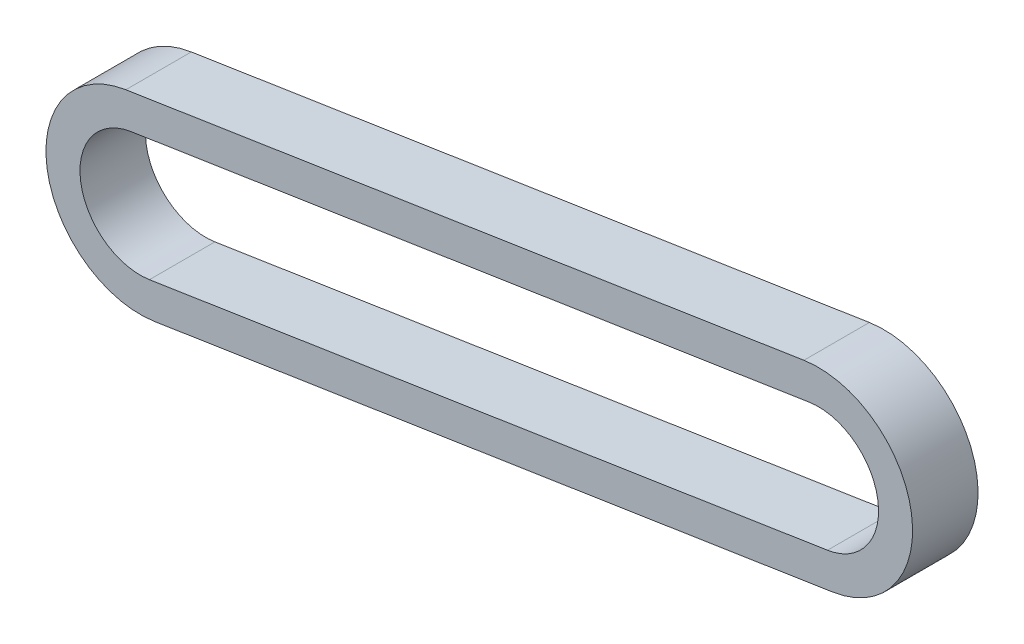
ISO-10303-21;
HEADER;
FILE_DESCRIPTION(('STEP AP214'),'2;1');
FILE_NAME('part.step','',(''),(''),'','','');
FILE_SCHEMA(('AUTOMOTIVE_DESIGN { 1 0 10303 214 1 1 1 1 }'));
ENDSEC;
DATA;
#1=APPLICATION_CONTEXT('core data for automotive mechanical design processes');
#2=APPLICATION_PROTOCOL_DEFINITION('international standard','automotive_design',2000,#1);
#3=PRODUCT_CONTEXT('',#1,'mechanical');
#4=PRODUCT('Part','Part','',(#3));
#5=PRODUCT_RELATED_PRODUCT_CATEGORY('part','',(#4));
#6=PRODUCT_DEFINITION_FORMATION('','',#4);
#7=PRODUCT_DEFINITION_CONTEXT('part definition',#1,'design');
#8=PRODUCT_DEFINITION('design','',#6,#7);
#9=PRODUCT_DEFINITION_SHAPE('','',#8);
#10=(LENGTH_UNIT() NAMED_UNIT(*) SI_UNIT(.MILLI.,.METRE.));
#11=(NAMED_UNIT(*) PLANE_ANGLE_UNIT() SI_UNIT($,.RADIAN.));
#12=(NAMED_UNIT(*) SI_UNIT($,.STERADIAN.) SOLID_ANGLE_UNIT());
#13=UNCERTAINTY_MEASURE_WITH_UNIT(LENGTH_MEASURE(1.E-05),#10,'distance_accuracy_value','');
#14=(GEOMETRIC_REPRESENTATION_CONTEXT(3) GLOBAL_UNCERTAINTY_ASSIGNED_CONTEXT((#13)) GLOBAL_UNIT_ASSIGNED_CONTEXT((#10,
#11,#12)) REPRESENTATION_CONTEXT('',''));
#15=CARTESIAN_POINT('',(0.,0.,0.));
#16=DIRECTION('',(0.,0.,1.));
#17=DIRECTION('',(1.,0.,0.));
#18=AXIS2_PLACEMENT_3D('',#15,#16,#17);
#19=CARTESIAN_POINT('',(32.883927320197,5.08,3.175));
#20=DIRECTION('',(0.,0.,1.));
#21=DIRECTION('',(1.,0.,0.));
#22=AXIS2_PLACEMENT_3D('',#19,#20,#21);
#23=PLANE('',#22);
#24=CARTESIAN_POINT('',(32.883927320197,5.08,3.175));
#25=DIRECTION('',(0.,0.,1.));
#26=DIRECTION('',(1.,0.,0.));
#27=AXIS2_PLACEMENT_3D('',#24,#25,#26);
#28=CIRCLE('',#27,4.572);
#29=CARTESIAN_POINT('',(33.5819425873726,0.561597772797356,3.175));
#30=VERTEX_POINT('',#29);
#31=CARTESIAN_POINT('',(32.1859120530214,9.59840222720264,3.175));
#32=VERTEX_POINT('',#31);
#33=EDGE_CURVE('E153',#30,#32,#28,.T.);
#34=ORIENTED_EDGE('',*,*,#33,.T.);
#35=DIRECTION('',(-0.988276952581506,-0.152671755725191,0.));
#36=VECTOR('',#35,1.);
#37=CARTESIAN_POINT('',(32.1859120530214,9.59840222720264,3.175));
#38=LINE('',#37,#36);
#39=CARTESIAN_POINT('',(-0.698015267175582,4.51840222720264,3.175));
#40=VERTEX_POINT('',#39);
#41=EDGE_CURVE('E157',#32,#40,#38,.T.);
#42=ORIENTED_EDGE('',*,*,#41,.T.);
#43=CARTESIAN_POINT('',(0.,0.,3.175));
#44=DIRECTION('',(0.,0.,1.));
#45=DIRECTION('',(1.,0.,0.));
#46=AXIS2_PLACEMENT_3D('',#43,#44,#45);
#47=CIRCLE('',#46,4.572);
#48=CARTESIAN_POINT('',(0.69801526717557,-4.51840222720264,3.175));
#49=VERTEX_POINT('',#48);
#50=EDGE_CURVE('E161',#40,#49,#47,.T.);
#51=ORIENTED_EDGE('',*,*,#50,.T.);
#52=DIRECTION('',(0.988276952581506,0.152671755725191,0.));
#53=VECTOR('',#52,1.);
#54=CARTESIAN_POINT('',(0.69801526717557,-4.51840222720265,3.175));
#55=LINE('',#54,#53);
#56=EDGE_CURVE('E164',#49,#30,#55,.T.);
#57=ORIENTED_EDGE('',*,*,#56,.T.);
#58=EDGE_LOOP('',(#34,#42,#51,#57));
#59=FACE_BOUND('',#58,.T.);
#60=DIRECTION('',(0.988276952581506,0.152671755725191,0.));
#61=VECTOR('',#60,1.);
#62=CARTESIAN_POINT('',(0.445954198473282,-2.88675697849058,3.175));
#63=LINE('',#62,#61);
#64=CARTESIAN_POINT('',(0.445954198473282,-2.88675697849058,3.175));
#65=VERTEX_POINT('',#64);
#66=CARTESIAN_POINT('',(33.3298815186703,2.19324302150942,3.175));
#67=VERTEX_POINT('',#66);
#68=EDGE_CURVE('E114',#65,#67,#63,.T.);
#69=ORIENTED_EDGE('',*,*,#68,.F.);
#70=CARTESIAN_POINT('',(0.,0.,3.175));
#71=DIRECTION('',(0.,0.,1.));
#72=DIRECTION('',(1.,0.,0.));
#73=AXIS2_PLACEMENT_3D('',#70,#71,#72);
#74=CIRCLE('',#73,2.921);
#75=CARTESIAN_POINT('',(-0.445954198473282,2.88675697849058,3.175));
#76=VERTEX_POINT('',#75);
#77=EDGE_CURVE('E105',#76,#65,#74,.T.);
#78=ORIENTED_EDGE('',*,*,#77,.F.);
#79=DIRECTION('',(-0.988276952581506,-0.152671755725191,0.));
#80=VECTOR('',#79,1.);
#81=CARTESIAN_POINT('',(32.4379731217237,7.96675697849058,3.175));
#82=LINE('',#81,#80);
#83=CARTESIAN_POINT('',(32.4379731217237,7.96675697849058,3.175));
#84=VERTEX_POINT('',#83);
#85=EDGE_CURVE('E131',#84,#76,#82,.T.);
#86=ORIENTED_EDGE('',*,*,#85,.F.);
#87=CARTESIAN_POINT('',(32.883927320197,5.08,3.175));
#88=DIRECTION('',(0.,0.,1.));
#89=DIRECTION('',(1.,0.,0.));
#90=AXIS2_PLACEMENT_3D('',#87,#88,#89);
#91=CIRCLE('',#90,2.921);
#92=EDGE_CURVE('E127',#67,#84,#91,.T.);
#93=ORIENTED_EDGE('',*,*,#92,.F.);
#94=EDGE_LOOP('',(#69,#78,#86,#93));
#95=FACE_BOUND('',#94,.T.);
#96=ADVANCED_FACE('F39',(#59,#95),#23,.T.);
#97=CARTESIAN_POINT('',(32.883927320197,5.08,0.));
#98=DIRECTION('',(0.,0.,1.));
#99=DIRECTION('',(1.,0.,0.));
#100=AXIS2_PLACEMENT_3D('',#97,#98,#99);
#101=PLANE('',#100);
#102=CARTESIAN_POINT('',(32.883927320197,5.08,0.));
#103=DIRECTION('',(0.,0.,1.));
#104=DIRECTION('',(1.,0.,0.));
#105=AXIS2_PLACEMENT_3D('',#102,#103,#104);
#106=CIRCLE('',#105,4.572);
#107=CARTESIAN_POINT('',(33.5819425873726,0.561597772797356,0.));
#108=VERTEX_POINT('',#107);
#109=CARTESIAN_POINT('',(32.1859120530214,9.59840222720264,0.));
#110=VERTEX_POINT('',#109);
#111=EDGE_CURVE('E123',#108,#110,#106,.T.);
#112=ORIENTED_EDGE('',*,*,#111,.F.);
#113=DIRECTION('',(0.988276952581506,0.152671755725191,0.));
#114=VECTOR('',#113,1.);
#115=CARTESIAN_POINT('',(0.69801526717557,-4.51840222720265,0.));
#116=LINE('',#115,#114);
#117=CARTESIAN_POINT('',(0.69801526717557,-4.51840222720264,0.));
#118=VERTEX_POINT('',#117);
#119=EDGE_CURVE('E158',#118,#108,#116,.T.);
#120=ORIENTED_EDGE('',*,*,#119,.F.);
#121=CARTESIAN_POINT('',(0.,0.,0.));
#122=DIRECTION('',(0.,0.,1.));
#123=DIRECTION('',(1.,0.,0.));
#124=AXIS2_PLACEMENT_3D('',#121,#122,#123);
#125=CIRCLE('',#124,4.572);
#126=CARTESIAN_POINT('',(-0.698015267175582,4.51840222720264,0.));
#127=VERTEX_POINT('',#126);
#128=EDGE_CURVE('E174',#127,#118,#125,.T.);
#129=ORIENTED_EDGE('',*,*,#128,.F.);
#130=DIRECTION('',(-0.988276952581506,-0.152671755725191,0.));
#131=VECTOR('',#130,1.);
#132=CARTESIAN_POINT('',(32.1859120530214,9.59840222720264,0.));
#133=LINE('',#132,#131);
#134=EDGE_CURVE('E171',#110,#127,#133,.T.);
#135=ORIENTED_EDGE('',*,*,#134,.F.);
#136=EDGE_LOOP('',(#112,#120,#129,#135));
#137=FACE_BOUND('',#136,.T.);
#138=CARTESIAN_POINT('',(0.,0.,0.));
#139=DIRECTION('',(0.,0.,1.));
#140=DIRECTION('',(1.,0.,0.));
#141=AXIS2_PLACEMENT_3D('',#138,#139,#140);
#142=CIRCLE('',#141,2.921);
#143=CARTESIAN_POINT('',(-0.445954198473278,2.88675697849058,0.));
#144=VERTEX_POINT('',#143);
#145=CARTESIAN_POINT('',(0.445954198473282,-2.88675697849058,0.));
#146=VERTEX_POINT('',#145);
#147=EDGE_CURVE('E63',#144,#146,#142,.T.);
#148=ORIENTED_EDGE('',*,*,#147,.T.);
#149=DIRECTION('',(0.988276952581506,0.152671755725191,0.));
#150=VECTOR('',#149,1.);
#151=CARTESIAN_POINT('',(0.445954198473282,-2.88675697849058,0.));
#152=LINE('',#151,#150);
#153=CARTESIAN_POINT('',(33.3298815186703,2.19324302150942,0.));
#154=VERTEX_POINT('',#153);
#155=EDGE_CURVE('E121',#146,#154,#152,.T.);
#156=ORIENTED_EDGE('',*,*,#155,.T.);
#157=CARTESIAN_POINT('',(32.883927320197,5.08,0.));
#158=DIRECTION('',(0.,0.,1.));
#159=DIRECTION('',(1.,0.,0.));
#160=AXIS2_PLACEMENT_3D('',#157,#158,#159);
#161=CIRCLE('',#160,2.921);
#162=CARTESIAN_POINT('',(32.4379731217237,7.96675697849058,0.));
#163=VERTEX_POINT('',#162);
#164=EDGE_CURVE('E140',#154,#163,#161,.T.);
#165=ORIENTED_EDGE('',*,*,#164,.T.);
#166=DIRECTION('',(-0.988276952581506,-0.152671755725191,0.));
#167=VECTOR('',#166,1.);
#168=CARTESIAN_POINT('',(32.4379731217237,7.96675697849058,0.));
#169=LINE('',#168,#167);
#170=EDGE_CURVE('E115',#163,#144,#169,.T.);
#171=ORIENTED_EDGE('',*,*,#170,.T.);
#172=EDGE_LOOP('',(#148,#156,#165,#171));
#173=FACE_BOUND('',#172,.T.);
#174=ADVANCED_FACE('F197',(#137,#173),#101,.F.);
#175=CARTESIAN_POINT('',(32.883927320197,5.08,3.175));
#176=DIRECTION('',(0.,0.,-1.));
#177=DIRECTION('',(-1.,0.,0.));
#178=AXIS2_PLACEMENT_3D('',#175,#176,#177);
#179=CYLINDRICAL_SURFACE('',#178,4.572);
#180=ORIENTED_EDGE('',*,*,#111,.T.);
#181=DIRECTION('',(0.,0.,-1.));
#182=VECTOR('',#181,1.);
#183=CARTESIAN_POINT('',(32.1859120530214,9.59840222720264,3.175));
#184=LINE('',#183,#182);
#185=EDGE_CURVE('E11',#32,#110,#184,.T.);
#186=ORIENTED_EDGE('',*,*,#185,.F.);
#187=ORIENTED_EDGE('',*,*,#33,.F.);
#188=DIRECTION('',(0.,0.,-1.));
#189=VECTOR('',#188,1.);
#190=CARTESIAN_POINT('',(33.5819425873726,0.561597772797356,3.175));
#191=LINE('',#190,#189);
#192=EDGE_CURVE('E167',#30,#108,#191,.T.);
#193=ORIENTED_EDGE('',*,*,#192,.T.);
#194=EDGE_LOOP('',(#180,#186,#187,#193));
#195=FACE_BOUND('',#194,.T.);
#196=ADVANCED_FACE('F41',(#195),#179,.T.);
#197=CARTESIAN_POINT('',(32.1859120530214,9.59840222720264,3.175));
#198=DIRECTION('',(0.152671755725191,-0.988276952581506,0.));
#199=DIRECTION('',(0.988276952581506,0.152671755725191,0.));
#200=AXIS2_PLACEMENT_3D('',#197,#198,#199);
#201=PLANE('',#200);
#202=ORIENTED_EDGE('',*,*,#134,.T.);
#203=DIRECTION('',(0.,0.,-1.));
#204=VECTOR('',#203,1.);
#205=CARTESIAN_POINT('',(-0.698015267175582,4.51840222720264,3.175));
#206=LINE('',#205,#204);
#207=EDGE_CURVE('E48',#40,#127,#206,.T.);
#208=ORIENTED_EDGE('',*,*,#207,.F.);
#209=ORIENTED_EDGE('',*,*,#41,.F.);
#210=ORIENTED_EDGE('',*,*,#185,.T.);
#211=EDGE_LOOP('',(#202,#208,#209,#210));
#212=FACE_BOUND('',#211,.T.);
#213=ADVANCED_FACE('F207',(#212),#201,.F.);
#214=CARTESIAN_POINT('',(0.,0.,3.175));
#215=DIRECTION('',(0.,0.,-1.));
#216=DIRECTION('',(-1.,0.,0.));
#217=AXIS2_PLACEMENT_3D('',#214,#215,#216);
#218=CYLINDRICAL_SURFACE('',#217,4.572);
#219=ORIENTED_EDGE('',*,*,#128,.T.);
#220=DIRECTION('',(0.,0.,-1.));
#221=VECTOR('',#220,1.);
#222=CARTESIAN_POINT('',(0.69801526717557,-4.51840222720264,3.175));
#223=LINE('',#222,#221);
#224=EDGE_CURVE('E182',#49,#118,#223,.T.);
#225=ORIENTED_EDGE('',*,*,#224,.F.);
#226=ORIENTED_EDGE('',*,*,#50,.F.);
#227=ORIENTED_EDGE('',*,*,#207,.T.);
#228=EDGE_LOOP('',(#219,#225,#226,#227));
#229=FACE_BOUND('',#228,.T.);
#230=ADVANCED_FACE('F191',(#229),#218,.T.);
#231=CARTESIAN_POINT('',(0.69801526717557,-4.51840222720265,3.175));
#232=DIRECTION('',(-0.152671755725191,0.988276952581506,0.));
#233=DIRECTION('',(-0.988276952581506,-0.152671755725191,0.));
#234=AXIS2_PLACEMENT_3D('',#231,#232,#233);
#235=PLANE('',#234);
#236=ORIENTED_EDGE('',*,*,#119,.T.);
#237=ORIENTED_EDGE('',*,*,#192,.F.);
#238=ORIENTED_EDGE('',*,*,#56,.F.);
#239=ORIENTED_EDGE('',*,*,#224,.T.);
#240=EDGE_LOOP('',(#236,#237,#238,#239));
#241=FACE_BOUND('',#240,.T.);
#242=ADVANCED_FACE('F201',(#241),#235,.F.);
#243=CARTESIAN_POINT('',(0.,0.,3.175));
#244=DIRECTION('',(0.,0.,-1.));
#245=DIRECTION('',(-1.,0.,0.));
#246=AXIS2_PLACEMENT_3D('',#243,#244,#245);
#247=CYLINDRICAL_SURFACE('',#246,2.921);
#248=ORIENTED_EDGE('',*,*,#147,.F.);
#249=DIRECTION('',(0.,0.,-1.));
#250=VECTOR('',#249,1.);
#251=CARTESIAN_POINT('',(-0.445954198473282,2.88675697849058,3.175));
#252=LINE('',#251,#250);
#253=EDGE_CURVE('E109',#76,#144,#252,.T.);
#254=ORIENTED_EDGE('',*,*,#253,.F.);
#255=ORIENTED_EDGE('',*,*,#77,.T.);
#256=DIRECTION('',(0.,0.,-1.));
#257=VECTOR('',#256,1.);
#258=CARTESIAN_POINT('',(0.445954198473282,-2.88675697849058,3.175));
#259=LINE('',#258,#257);
#260=EDGE_CURVE('E108',#65,#146,#259,.T.);
#261=ORIENTED_EDGE('',*,*,#260,.T.);
#262=EDGE_LOOP('',(#248,#254,#255,#261));
#263=FACE_BOUND('',#262,.T.);
#264=ADVANCED_FACE('F107',(#263),#247,.F.);
#265=CARTESIAN_POINT('',(0.445954198473282,-2.88675697849058,3.175));
#266=DIRECTION('',(-0.152671755725191,0.988276952581506,0.));
#267=DIRECTION('',(-0.988276952581506,-0.152671755725191,0.));
#268=AXIS2_PLACEMENT_3D('',#265,#266,#267);
#269=PLANE('',#268);
#270=ORIENTED_EDGE('',*,*,#155,.F.);
#271=ORIENTED_EDGE('',*,*,#260,.F.);
#272=ORIENTED_EDGE('',*,*,#68,.T.);
#273=DIRECTION('',(0.,0.,-1.));
#274=VECTOR('',#273,1.);
#275=CARTESIAN_POINT('',(33.3298815186703,2.19324302150942,3.175));
#276=LINE('',#275,#274);
#277=EDGE_CURVE('E124',#67,#154,#276,.T.);
#278=ORIENTED_EDGE('',*,*,#277,.T.);
#279=EDGE_LOOP('',(#270,#271,#272,#278));
#280=FACE_BOUND('',#279,.T.);
#281=ADVANCED_FACE('F118',(#280),#269,.T.);
#282=CARTESIAN_POINT('',(32.883927320197,5.08,3.175));
#283=DIRECTION('',(0.,0.,-1.));
#284=DIRECTION('',(-1.,0.,0.));
#285=AXIS2_PLACEMENT_3D('',#282,#283,#284);
#286=CYLINDRICAL_SURFACE('',#285,2.921);
#287=ORIENTED_EDGE('',*,*,#164,.F.);
#288=ORIENTED_EDGE('',*,*,#277,.F.);
#289=ORIENTED_EDGE('',*,*,#92,.T.);
#290=DIRECTION('',(0.,0.,-1.));
#291=VECTOR('',#290,1.);
#292=CARTESIAN_POINT('',(32.4379731217237,7.96675697849058,3.175));
#293=LINE('',#292,#291);
#294=EDGE_CURVE('E55',#84,#163,#293,.T.);
#295=ORIENTED_EDGE('',*,*,#294,.T.);
#296=EDGE_LOOP('',(#287,#288,#289,#295));
#297=FACE_BOUND('',#296,.T.);
#298=ADVANCED_FACE('F230',(#297),#286,.F.);
#299=CARTESIAN_POINT('',(32.4379731217237,7.96675697849058,3.175));
#300=DIRECTION('',(0.152671755725191,-0.988276952581506,0.));
#301=DIRECTION('',(0.988276952581506,0.152671755725191,0.));
#302=AXIS2_PLACEMENT_3D('',#299,#300,#301);
#303=PLANE('',#302);
#304=ORIENTED_EDGE('',*,*,#170,.F.);
#305=ORIENTED_EDGE('',*,*,#294,.F.);
#306=ORIENTED_EDGE('',*,*,#85,.T.);
#307=ORIENTED_EDGE('',*,*,#253,.T.);
#308=EDGE_LOOP('',(#304,#305,#306,#307));
#309=FACE_BOUND('',#308,.T.);
#310=ADVANCED_FACE('F234',(#309),#303,.T.);
#311=CLOSED_SHELL('',(#96,#174,#196,#213,#230,#242,#264,#281,#298,#310));
#312=MANIFOLD_SOLID_BREP('B2',#311);
#313=ADVANCED_BREP_SHAPE_REPRESENTATION('',(#18,#312),#14);
#314=SHAPE_DEFINITION_REPRESENTATION(#9,#313);
ENDSEC;
END-ISO-10303-21;
